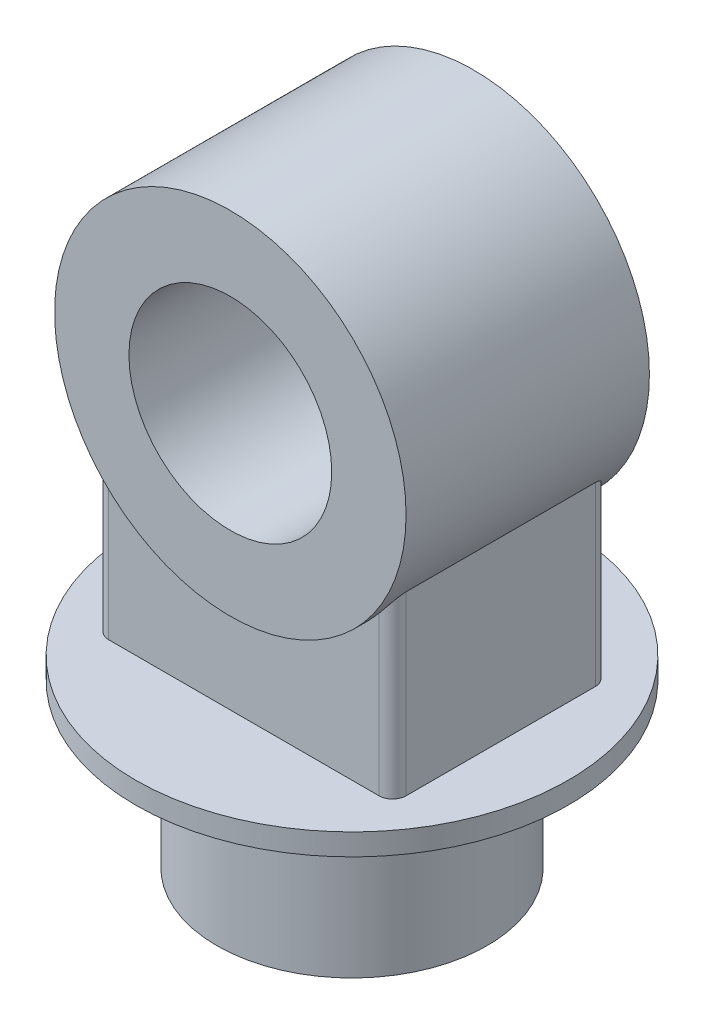
ISO-10303-21;
HEADER;
FILE_DESCRIPTION(('STEP AP214'),'2;1');
FILE_NAME('part.step','',(''),(''),'','','');
FILE_SCHEMA(('AUTOMOTIVE_DESIGN { 1 0 10303 214 1 1 1 1 }'));
ENDSEC;
DATA;
#1=APPLICATION_CONTEXT('core data for automotive mechanical design processes');
#2=APPLICATION_PROTOCOL_DEFINITION('international standard','automotive_design',2000,#1);
#3=PRODUCT_CONTEXT('',#1,'mechanical');
#4=PRODUCT('Part','Part','',(#3));
#5=PRODUCT_RELATED_PRODUCT_CATEGORY('part','',(#4));
#6=PRODUCT_DEFINITION_FORMATION('','',#4);
#7=PRODUCT_DEFINITION_CONTEXT('part definition',#1,'design');
#8=PRODUCT_DEFINITION('design','',#6,#7);
#9=PRODUCT_DEFINITION_SHAPE('','',#8);
#10=(LENGTH_UNIT() NAMED_UNIT(*) SI_UNIT(.MILLI.,.METRE.));
#11=(NAMED_UNIT(*) PLANE_ANGLE_UNIT() SI_UNIT($,.RADIAN.));
#12=(NAMED_UNIT(*) SI_UNIT($,.STERADIAN.) SOLID_ANGLE_UNIT());
#13=UNCERTAINTY_MEASURE_WITH_UNIT(LENGTH_MEASURE(1.E-05),#10,'distance_accuracy_value','');
#14=(GEOMETRIC_REPRESENTATION_CONTEXT(3) GLOBAL_UNCERTAINTY_ASSIGNED_CONTEXT((#13)) GLOBAL_UNIT_ASSIGNED_CONTEXT((#10,
#11,#12)) REPRESENTATION_CONTEXT('',''));
#15=CARTESIAN_POINT('',(0.,0.,0.));
#16=DIRECTION('',(0.,0.,1.));
#17=DIRECTION('',(1.,0.,0.));
#18=AXIS2_PLACEMENT_3D('',#15,#16,#17);
#19=CARTESIAN_POINT('',(0.,120.,0.));
#20=DIRECTION('',(0.,-1.,0.));
#21=DIRECTION('',(0.,0.,-1.));
#22=AXIS2_PLACEMENT_3D('',#19,#20,#21);
#23=CYLINDRICAL_SURFACE('',#22,100.);
#24=CARTESIAN_POINT('',(0.,120.,0.));
#25=DIRECTION('',(0.,1.,0.));
#26=DIRECTION('',(0.,0.,1.));
#27=AXIS2_PLACEMENT_3D('',#24,#25,#26);
#28=CIRCLE('',#27,100.);
#29=CARTESIAN_POINT('',(0.,120.,100.));
#30=VERTEX_POINT('',#29);
#31=EDGE_CURVE('E137',#30,#30,#28,.T.);
#32=ORIENTED_EDGE('',*,*,#31,.F.);
#33=EDGE_LOOP('',(#32));
#34=FACE_BOUND('',#33,.T.);
#35=CARTESIAN_POINT('',(0.,0.,0.));
#36=DIRECTION('',(0.,1.,0.));
#37=DIRECTION('',(0.,0.,1.));
#38=AXIS2_PLACEMENT_3D('',#35,#36,#37);
#39=CIRCLE('',#38,100.);
#40=CARTESIAN_POINT('',(0.,0.,100.));
#41=VERTEX_POINT('',#40);
#42=EDGE_CURVE('E213',#41,#41,#39,.T.);
#43=ORIENTED_EDGE('',*,*,#42,.T.);
#44=EDGE_LOOP('',(#43));
#45=FACE_BOUND('',#44,.T.);
#46=ADVANCED_FACE('F37',(#34,#45),#23,.T.);
#47=CARTESIAN_POINT('',(0.,0.,0.));
#48=DIRECTION('',(0.,1.,0.));
#49=DIRECTION('',(0.,0.,1.));
#50=AXIS2_PLACEMENT_3D('',#47,#48,#49);
#51=PLANE('',#50);
#52=ORIENTED_EDGE('',*,*,#42,.F.);
#53=EDGE_LOOP('',(#52));
#54=FACE_BOUND('',#53,.T.);
#55=ADVANCED_FACE('F201',(#54),#51,.F.);
#56=CARTESIAN_POINT('',(0.,136.,0.));
#57=DIRECTION('',(0.,-1.,0.));
#58=DIRECTION('',(0.,0.,-1.));
#59=AXIS2_PLACEMENT_3D('',#56,#57,#58);
#60=CYLINDRICAL_SURFACE('',#59,160.);
#61=CARTESIAN_POINT('',(0.,136.,0.));
#62=DIRECTION('',(0.,1.,0.));
#63=DIRECTION('',(0.,0.,1.));
#64=AXIS2_PLACEMENT_3D('',#61,#62,#63);
#65=CIRCLE('',#64,160.);
#66=CARTESIAN_POINT('',(0.,136.,160.));
#67=VERTEX_POINT('',#66);
#68=EDGE_CURVE('E214',#67,#67,#65,.T.);
#69=ORIENTED_EDGE('',*,*,#68,.F.);
#70=EDGE_LOOP('',(#69));
#71=FACE_BOUND('',#70,.T.);
#72=CARTESIAN_POINT('',(0.,120.,0.));
#73=DIRECTION('',(0.,1.,0.));
#74=DIRECTION('',(0.,0.,1.));
#75=AXIS2_PLACEMENT_3D('',#72,#73,#74);
#76=CIRCLE('',#75,160.);
#77=CARTESIAN_POINT('',(0.,120.,160.));
#78=VERTEX_POINT('',#77);
#79=EDGE_CURVE('E129',#78,#78,#76,.T.);
#80=ORIENTED_EDGE('',*,*,#79,.T.);
#81=EDGE_LOOP('',(#80));
#82=FACE_BOUND('',#81,.T.);
#83=ADVANCED_FACE('F206',(#71,#82),#60,.T.);
#84=CARTESIAN_POINT('',(0.,136.,0.));
#85=DIRECTION('',(0.,1.,0.));
#86=DIRECTION('',(0.,0.,1.));
#87=AXIS2_PLACEMENT_3D('',#84,#85,#86);
#88=PLANE('',#87);
#89=DIRECTION('',(0.,0.,1.));
#90=VECTOR('',#89,1.);
#91=CARTESIAN_POINT('',(-110.,136.,80.));
#92=LINE('',#91,#90);
#93=CARTESIAN_POINT('',(-110.,136.,-70.));
#94=VERTEX_POINT('',#93);
#95=CARTESIAN_POINT('',(-110.,136.,70.));
#96=VERTEX_POINT('',#95);
#97=EDGE_CURVE('E224',#94,#96,#92,.T.);
#98=ORIENTED_EDGE('',*,*,#97,.F.);
#99=CARTESIAN_POINT('',(-100.,136.,-70.));
#100=DIRECTION('',(0.,1.,0.));
#101=DIRECTION('',(0.,0.,1.));
#102=AXIS2_PLACEMENT_3D('',#99,#100,#101);
#103=CIRCLE('',#102,10.);
#104=CARTESIAN_POINT('',(-100.,136.,-80.));
#105=VERTEX_POINT('',#104);
#106=EDGE_CURVE('E65',#94,#105,#103,.F.);
#107=ORIENTED_EDGE('',*,*,#106,.T.);
#108=DIRECTION('',(-1.,0.,0.));
#109=VECTOR('',#108,1.);
#110=CARTESIAN_POINT('',(110.,136.,-80.));
#111=LINE('',#110,#109);
#112=CARTESIAN_POINT('',(100.,136.,-80.));
#113=VERTEX_POINT('',#112);
#114=EDGE_CURVE('E226',#113,#105,#111,.T.);
#115=ORIENTED_EDGE('',*,*,#114,.F.);
#116=CARTESIAN_POINT('',(100.,136.,-70.));
#117=DIRECTION('',(0.,1.,0.));
#118=DIRECTION('',(0.,0.,1.));
#119=AXIS2_PLACEMENT_3D('',#116,#117,#118);
#120=CIRCLE('',#119,10.);
#121=CARTESIAN_POINT('',(110.,136.,-70.));
#122=VERTEX_POINT('',#121);
#123=EDGE_CURVE('E120',#113,#122,#120,.F.);
#124=ORIENTED_EDGE('',*,*,#123,.T.);
#125=DIRECTION('',(0.,0.,-1.));
#126=VECTOR('',#125,1.);
#127=CARTESIAN_POINT('',(110.,136.,80.));
#128=LINE('',#127,#126);
#129=CARTESIAN_POINT('',(110.,136.,70.));
#130=VERTEX_POINT('',#129);
#131=EDGE_CURVE('E230',#130,#122,#128,.T.);
#132=ORIENTED_EDGE('',*,*,#131,.F.);
#133=CARTESIAN_POINT('',(100.,136.,70.));
#134=DIRECTION('',(0.,1.,0.));
#135=DIRECTION('',(0.,0.,1.));
#136=AXIS2_PLACEMENT_3D('',#133,#134,#135);
#137=CIRCLE('',#136,10.);
#138=CARTESIAN_POINT('',(100.,136.,80.));
#139=VERTEX_POINT('',#138);
#140=EDGE_CURVE('E119',#130,#139,#137,.F.);
#141=ORIENTED_EDGE('',*,*,#140,.T.);
#142=DIRECTION('',(1.,0.,0.));
#143=VECTOR('',#142,1.);
#144=CARTESIAN_POINT('',(110.,136.,80.));
#145=LINE('',#144,#143);
#146=CARTESIAN_POINT('',(-100.,136.,80.));
#147=VERTEX_POINT('',#146);
#148=EDGE_CURVE('E193',#147,#139,#145,.T.);
#149=ORIENTED_EDGE('',*,*,#148,.F.);
#150=CARTESIAN_POINT('',(-100.,136.,70.));
#151=DIRECTION('',(0.,1.,0.));
#152=DIRECTION('',(0.,0.,1.));
#153=AXIS2_PLACEMENT_3D('',#150,#151,#152);
#154=CIRCLE('',#153,10.);
#155=EDGE_CURVE('E51',#147,#96,#154,.F.);
#156=ORIENTED_EDGE('',*,*,#155,.T.);
#157=EDGE_LOOP('',(#98,#107,#115,#124,#132,#141,#149,#156));
#158=FACE_BOUND('',#157,.T.);
#159=ORIENTED_EDGE('',*,*,#68,.T.);
#160=EDGE_LOOP('',(#159));
#161=FACE_BOUND('',#160,.T.);
#162=ADVANCED_FACE('F343',(#158,#161),#88,.T.);
#163=CARTESIAN_POINT('',(0.,120.,0.));
#164=DIRECTION('',(0.,1.,0.));
#165=DIRECTION('',(0.,0.,1.));
#166=AXIS2_PLACEMENT_3D('',#163,#164,#165);
#167=PLANE('',#166);
#168=ORIENTED_EDGE('',*,*,#31,.T.);
#169=EDGE_LOOP('',(#168));
#170=FACE_BOUND('',#169,.T.);
#171=ORIENTED_EDGE('',*,*,#79,.F.);
#172=EDGE_LOOP('',(#171));
#173=FACE_BOUND('',#172,.T.);
#174=ADVANCED_FACE('F320',(#170,#173),#167,.F.);
#175=CARTESIAN_POINT('',(110.,466.002,80.));
#176=DIRECTION('',(0.,0.,-1.));
#177=DIRECTION('',(-1.,0.,0.));
#178=AXIS2_PLACEMENT_3D('',#175,#176,#177);
#179=PLANE('',#178);
#180=ORIENTED_EDGE('',*,*,#148,.T.);
#181=DIRECTION('',(0.,-1.,0.));
#182=VECTOR('',#181,1.);
#183=CARTESIAN_POINT('',(100.,466.002,80.));
#184=LINE('',#183,#182);
#185=CARTESIAN_POINT('',(100.,252.933761370819,80.));
#186=VERTEX_POINT('',#185);
#187=EDGE_CURVE('E145',#139,#186,#184,.F.);
#188=ORIENTED_EDGE('',*,*,#187,.T.);
#189=CARTESIAN_POINT('',(0.,336.,80.));
#190=DIRECTION('',(0.,0.,-1.));
#191=DIRECTION('',(-1.,0.,0.));
#192=AXIS2_PLACEMENT_3D('',#189,#190,#191);
#193=CIRCLE('',#192,130.);
#194=CARTESIAN_POINT('',(-100.,252.933761370819,80.));
#195=VERTEX_POINT('',#194);
#196=EDGE_CURVE('E192',#195,#186,#193,.F.);
#197=ORIENTED_EDGE('',*,*,#196,.F.);
#198=DIRECTION('',(0.,-1.,0.));
#199=VECTOR('',#198,1.);
#200=CARTESIAN_POINT('',(-100.,466.002,80.));
#201=LINE('',#200,#199);
#202=EDGE_CURVE('E142',#195,#147,#201,.T.);
#203=ORIENTED_EDGE('',*,*,#202,.T.);
#204=EDGE_LOOP('',(#180,#188,#197,#203));
#205=FACE_BOUND('',#204,.T.);
#206=ADVANCED_FACE('F313',(#205),#179,.F.);
#207=CARTESIAN_POINT('',(-110.,466.002,80.));
#208=DIRECTION('',(1.,0.,0.));
#209=DIRECTION('',(0.,0.,-1.));
#210=AXIS2_PLACEMENT_3D('',#207,#208,#209);
#211=PLANE('',#210);
#212=DIRECTION('',(0.,0.,-1.));
#213=VECTOR('',#212,1.);
#214=CARTESIAN_POINT('',(-110.,266.717967697245,90.));
#215=LINE('',#214,#213);
#216=CARTESIAN_POINT('',(-110.,266.717967697245,-69.9999999999999));
#217=VERTEX_POINT('',#216);
#218=CARTESIAN_POINT('',(-110.,266.717967697245,70.));
#219=VERTEX_POINT('',#218);
#220=EDGE_CURVE('E187',#217,#219,#215,.F.);
#221=ORIENTED_EDGE('',*,*,#220,.F.);
#222=DIRECTION('',(0.,-1.,0.));
#223=VECTOR('',#222,1.);
#224=CARTESIAN_POINT('',(-110.,466.002,-70.));
#225=LINE('',#224,#223);
#226=EDGE_CURVE('E149',#217,#94,#225,.T.);
#227=ORIENTED_EDGE('',*,*,#226,.T.);
#228=ORIENTED_EDGE('',*,*,#97,.T.);
#229=DIRECTION('',(0.,-1.,0.));
#230=VECTOR('',#229,1.);
#231=CARTESIAN_POINT('',(-110.,466.002,70.));
#232=LINE('',#231,#230);
#233=EDGE_CURVE('E147',#96,#219,#232,.F.);
#234=ORIENTED_EDGE('',*,*,#233,.T.);
#235=EDGE_LOOP('',(#221,#227,#228,#234));
#236=FACE_BOUND('',#235,.T.);
#237=ADVANCED_FACE('F190',(#236),#211,.F.);
#238=CARTESIAN_POINT('',(110.,466.002,80.));
#239=DIRECTION('',(-1.,0.,0.));
#240=DIRECTION('',(0.,0.,1.));
#241=AXIS2_PLACEMENT_3D('',#238,#239,#240);
#242=PLANE('',#241);
#243=ORIENTED_EDGE('',*,*,#131,.T.);
#244=DIRECTION('',(0.,-1.,0.));
#245=VECTOR('',#244,1.);
#246=CARTESIAN_POINT('',(110.,466.002,-70.));
#247=LINE('',#246,#245);
#248=CARTESIAN_POINT('',(110.,266.717967697245,-70.));
#249=VERTEX_POINT('',#248);
#250=EDGE_CURVE('E135',#122,#249,#247,.F.);
#251=ORIENTED_EDGE('',*,*,#250,.T.);
#252=DIRECTION('',(0.,0.,-1.));
#253=VECTOR('',#252,1.);
#254=CARTESIAN_POINT('',(110.,266.717967697245,90.));
#255=LINE('',#254,#253);
#256=CARTESIAN_POINT('',(110.,266.717967697245,70.));
#257=VERTEX_POINT('',#256);
#258=EDGE_CURVE('E115',#257,#249,#255,.T.);
#259=ORIENTED_EDGE('',*,*,#258,.F.);
#260=DIRECTION('',(0.,-1.,0.));
#261=VECTOR('',#260,1.);
#262=CARTESIAN_POINT('',(110.,466.002,70.));
#263=LINE('',#262,#261);
#264=EDGE_CURVE('E132',#257,#130,#263,.T.);
#265=ORIENTED_EDGE('',*,*,#264,.T.);
#266=EDGE_LOOP('',(#243,#251,#259,#265));
#267=FACE_BOUND('',#266,.T.);
#268=ADVANCED_FACE('F297',(#267),#242,.F.);
#269=CARTESIAN_POINT('',(110.,466.002,-80.));
#270=DIRECTION('',(0.,0.,1.));
#271=DIRECTION('',(1.,0.,0.));
#272=AXIS2_PLACEMENT_3D('',#269,#270,#271);
#273=PLANE('',#272);
#274=CARTESIAN_POINT('',(0.,336.,-80.));
#275=DIRECTION('',(0.,0.,1.));
#276=DIRECTION('',(1.,0.,0.));
#277=AXIS2_PLACEMENT_3D('',#274,#275,#276);
#278=CIRCLE('',#277,130.);
#279=CARTESIAN_POINT('',(100.,252.933761370819,-80.));
#280=VERTEX_POINT('',#279);
#281=CARTESIAN_POINT('',(-100.,252.933761370819,-79.9999999999999));
#282=VERTEX_POINT('',#281);
#283=EDGE_CURVE('E112',#280,#282,#278,.F.);
#284=ORIENTED_EDGE('',*,*,#283,.F.);
#285=DIRECTION('',(0.,-1.,0.));
#286=VECTOR('',#285,1.);
#287=CARTESIAN_POINT('',(100.,466.002,-80.));
#288=LINE('',#287,#286);
#289=EDGE_CURVE('E126',#280,#113,#288,.T.);
#290=ORIENTED_EDGE('',*,*,#289,.T.);
#291=ORIENTED_EDGE('',*,*,#114,.T.);
#292=DIRECTION('',(0.,-1.,0.));
#293=VECTOR('',#292,1.);
#294=CARTESIAN_POINT('',(-100.,466.002,-80.));
#295=LINE('',#294,#293);
#296=EDGE_CURVE('E128',#105,#282,#295,.F.);
#297=ORIENTED_EDGE('',*,*,#296,.T.);
#298=EDGE_LOOP('',(#284,#290,#291,#297));
#299=FACE_BOUND('',#298,.T.);
#300=ADVANCED_FACE('F124',(#299),#273,.F.);
#301=CARTESIAN_POINT('',(0.,336.,90.));
#302=DIRECTION('',(0.,0.,-1.));
#303=DIRECTION('',(-1.,0.,0.));
#304=AXIS2_PLACEMENT_3D('',#301,#302,#303);
#305=CYLINDRICAL_SURFACE('',#304,130.);
#306=CARTESIAN_POINT('',(0.,336.,90.));
#307=DIRECTION('',(0.,0.,1.));
#308=DIRECTION('',(1.,0.,0.));
#309=AXIS2_PLACEMENT_3D('',#306,#307,#308);
#310=CIRCLE('',#309,130.);
#311=CARTESIAN_POINT('',(130.,336.,90.));
#312=VERTEX_POINT('',#311);
#313=EDGE_CURVE('E227',#312,#312,#310,.T.);
#314=ORIENTED_EDGE('',*,*,#313,.F.);
#315=EDGE_LOOP('',(#314));
#316=FACE_BOUND('',#315,.T.);
#317=CARTESIAN_POINT('',(0.,336.,-90.));
#318=DIRECTION('',(0.,0.,1.));
#319=DIRECTION('',(1.,0.,0.));
#320=AXIS2_PLACEMENT_3D('',#317,#318,#319);
#321=CIRCLE('',#320,130.);
#322=CARTESIAN_POINT('',(130.,336.,-90.));
#323=VERTEX_POINT('',#322);
#324=EDGE_CURVE('E234',#323,#323,#321,.T.);
#325=ORIENTED_EDGE('',*,*,#324,.T.);
#326=EDGE_LOOP('',(#325));
#327=FACE_BOUND('',#326,.T.);
#328=ORIENTED_EDGE('',*,*,#283,.T.);
#329=CARTESIAN_POINT('',(-100.,252.933761370819,-80.));
#330=CARTESIAN_POINT('',(-100.223611151915,253.202952503255,-79.9999830665315));
#331=CARTESIAN_POINT('',(-100.446118360057,253.473036166024,-79.9924995885084));
#332=CARTESIAN_POINT('',(-100.888548742496,254.014496760122,-79.9629173131462));
#333=CARTESIAN_POINT('',(-101.108472043759,254.285873626978,-79.9408192370115));
#334=CARTESIAN_POINT('',(-101.545586290072,254.829711400373,-79.8822979337703));
#335=CARTESIAN_POINT('',(-101.76277446753,255.102173087004,-79.8458612385231));
#336=CARTESIAN_POINT('',(-102.193849033468,255.647413797012,-79.7588609087487));
#337=CARTESIAN_POINT('',(-102.407735374993,255.920192824843,-79.7082970735217));
#338=CARTESIAN_POINT('',(-103.048408055095,256.74400885936,-79.5343891784366));
#339=CARTESIAN_POINT('',(-103.469748368072,257.294974230618,-79.3894263280957));
#340=CARTESIAN_POINT('',(-104.088382224678,258.11722484377,-79.1288060997197));
#341=CARTESIAN_POINT('',(-104.292337034927,258.39057162742,-79.0347525474724));
#342=CARTESIAN_POINT('',(-104.695498702643,258.935304765081,-78.8319429710981));
#343=CARTESIAN_POINT('',(-104.894706004332,259.206691300842,-78.7231883289499));
#344=CARTESIAN_POINT('',(-105.336170271764,259.812965668139,-78.4620472638272));
#345=CARTESIAN_POINT('',(-105.577006541077,260.147108038148,-78.3055009036512));
#346=CARTESIAN_POINT('',(-106.04966094987,260.809343252621,-77.9678086263909));
#347=CARTESIAN_POINT('',(-106.281479043935,261.137436066616,-77.7866625854443));
#348=CARTESIAN_POINT('',(-106.734152264033,261.784259610706,-77.3986376161628));
#349=CARTESIAN_POINT('',(-106.955036134368,262.103013877598,-77.1918317878757));
#350=CARTESIAN_POINT('',(-107.384708325122,262.728803605627,-76.749894392022));
#351=CARTESIAN_POINT('',(-107.593501627276,263.035843875289,-76.5147746155492));
#352=CARTESIAN_POINT('',(-107.921279015409,263.522080966666,-76.1068757916445));
#353=CARTESIAN_POINT('',(-108.044709884718,263.706240813682,-75.9435605188262));
#354=CARTESIAN_POINT('',(-108.284949666933,264.066582834907,-75.6038296157537));
#355=CARTESIAN_POINT('',(-108.401760304956,264.242767084986,-75.4274174262628));
#356=CARTESIAN_POINT('',(-108.627683741988,264.585236991633,-75.0605773993745));
#357=CARTESIAN_POINT('',(-108.736797961361,264.751524473746,-74.8701521613912));
#358=CARTESIAN_POINT('',(-108.945874410432,265.071634412635,-74.4745306992527));
#359=CARTESIAN_POINT('',(-109.04583974995,265.225461102935,-74.2693395369044));
#360=CARTESIAN_POINT('',(-109.274660386151,265.579056080623,-73.7536743100226));
#361=CARTESIAN_POINT('',(-109.398046362816,265.771031349643,-73.4351396850741));
#362=CARTESIAN_POINT('',(-109.561336457207,266.026263049992,-72.9345418523035));
#363=CARTESIAN_POINT('',(-109.612072269395,266.105785634321,-72.7641622498836));
#364=CARTESIAN_POINT('',(-109.705421847597,266.25239837099,-72.4160328323222));
#365=CARTESIAN_POINT('',(-109.748040656091,266.319496241142,-72.2382876769632));
#366=CARTESIAN_POINT('',(-109.820262744001,266.433384610412,-71.8947331689276));
#367=CARTESIAN_POINT('',(-109.850752312767,266.481551609067,-71.7295676109389));
#368=CARTESIAN_POINT('',(-109.903691363628,266.565274678987,-71.3948451418075));
#369=CARTESIAN_POINT('',(-109.926143541964,266.600834979285,-71.2252897238032));
#370=CARTESIAN_POINT('',(-109.962659042777,266.658707696818,-70.8807814271977));
#371=CARTESIAN_POINT('',(-109.976613864032,266.680848750137,-70.7057875562756));
#372=CARTESIAN_POINT('',(-109.99061964662,266.703076138542,-70.4419386674802));
#373=CARTESIAN_POINT('',(-109.99413386492,266.708654625171,-70.3536902139711));
#374=CARTESIAN_POINT('',(-109.998824989492,266.716102079045,-70.1769662160102));
#375=CARTESIAN_POINT('',(-110.000001659485,266.717970671296,-70.088490649507));
#376=CARTESIAN_POINT('',(-110.,266.717967697245,-70.));
#377=B_SPLINE_CURVE_WITH_KNOTS('',3,(#329,#330,#331,#332,#333,#334,#335,#336,#337,#338,#339,
#340,#341,#342,#343,#344,#345,#346,#347,#348,#349,#350,#351,#352,#353,#354,#355,#356,#357,#358,
#359,#360,#361,#362,#363,#364,#365,#366,#367,#368,#369,#370,#371,#372,#373,#374,#375,#376),
.UNSPECIFIED.,.F.,.F.,(4,2,2,2,2,2,2,2,2,2,2,2,2,2,2,2,2,2,2,2,2,2,2,4),(0.,1.04974156507777,
2.09943133114573,3.15010942417273,4.20080244462032,6.32356278933855,7.38465211465328,
8.44564176134501,9.766776855394,11.0879186017609,12.4053795382949,13.7222937149077,
14.5479419827464,15.3733741023698,16.1986534888326,17.023651302289,18.194686650492,
18.7783719827905,19.3616935243416,19.8852298594993,20.4085904030381,20.9385006934629,
21.2038887699912,21.4693036704869),.UNSPECIFIED.);
#378=EDGE_CURVE('E180',#282,#217,#377,.T.);
#379=ORIENTED_EDGE('',*,*,#378,.T.);
#380=ORIENTED_EDGE('',*,*,#220,.T.);
#381=CARTESIAN_POINT('',(-110.,266.717967697245,70.));
#382=CARTESIAN_POINT('',(-110.000033683462,266.718025852698,70.1614230595313));
#383=CARTESIAN_POINT('',(-109.996092792414,266.711764254296,70.3228118197691));
#384=CARTESIAN_POINT('',(-109.980519982779,266.687045880384,70.6441123999958));
#385=CARTESIAN_POINT('',(-109.968896213713,266.668602027069,70.8040256031146));
#386=CARTESIAN_POINT('',(-109.938376398954,266.620217986395,71.1196424551221));
#387=CARTESIAN_POINT('',(-109.919558261622,266.590400967593,71.2753727040436));
#388=CARTESIAN_POINT('',(-109.875071558334,266.52000006118,71.5834085562727));
#389=CARTESIAN_POINT('',(-109.849400846184,266.479412800404,71.735713070425));
#390=CARTESIAN_POINT('',(-109.784772267017,266.377386983169,72.0722520040975));
#391=CARTESIAN_POINT('',(-109.744103525393,266.313281105855,72.2553511890568));
#392=CARTESIAN_POINT('',(-109.654040532803,266.171650231929,72.6141464391851));
#393=CARTESIAN_POINT('',(-109.604640075501,266.094115691273,72.7898371277865));
#394=CARTESIAN_POINT('',(-109.497968805892,265.927147418338,73.1338723913451));
#395=CARTESIAN_POINT('',(-109.440667457039,265.837667562915,73.302184951541));
#396=CARTESIAN_POINT('',(-109.319341126161,265.648779195145,73.6304969218558));
#397=CARTESIAN_POINT('',(-109.25531768694,265.549372961282,73.7904982269664));
#398=CARTESIAN_POINT('',(-109.085069343255,265.28590129292,74.1868876463209));
#399=CARTESIAN_POINT('',(-108.974781990569,265.115997241409,74.4176642111939));
#400=CARTESIAN_POINT('',(-108.742772943656,264.76058359918,74.8607110351427));
#401=CARTESIAN_POINT('',(-108.621044869784,264.575065307649,75.072970840064));
#402=CARTESIAN_POINT('',(-108.36794946479,264.19164129378,75.4804206329535));
#403=CARTESIAN_POINT('',(-108.236568322626,263.993717884812,75.6755852518652));
#404=CARTESIAN_POINT('',(-107.965814499919,263.588382733387,76.0497203250662));
#405=CARTESIAN_POINT('',(-107.826442440892,263.380971729107,76.2286920360201));
#406=CARTESIAN_POINT('',(-107.56145650763,262.989174407744,76.5468161797373));
#407=CARTESIAN_POINT('',(-107.436764821801,262.805791987749,76.6879854690674));
#408=CARTESIAN_POINT('',(-107.182869679799,262.434497987953,76.9599552926784));
#409=CARTESIAN_POINT('',(-107.053665586411,262.24658576965,77.0907543539386));
#410=CARTESIAN_POINT('',(-106.659844344167,261.677121003612,77.4685356621902));
#411=CARTESIAN_POINT('',(-106.389102445143,261.289965080353,77.7008024816961));
#412=CARTESIAN_POINT('',(-105.833418194947,260.504836154638,78.129863631631));
#413=CARTESIAN_POINT('',(-105.548442441802,260.106838810795,78.3265689888296));
#414=CARTESIAN_POINT('',(-104.96676628824,259.304344779382,78.6860846955172));
#415=CARTESIAN_POINT('',(-104.670068038633,258.899849292081,78.8489012287858));
#416=CARTESIAN_POINT('',(-104.024574509401,258.030646711215,79.1623550419402));
#417=CARTESIAN_POINT('',(-103.674248758637,257.565348460988,79.3081944572229));
#418=CARTESIAN_POINT('',(-102.961876677953,256.632523338709,79.558756520093));
#419=CARTESIAN_POINT('',(-102.599828734006,256.16499616738,79.6634734792563));
#420=CARTESIAN_POINT('',(-102.051092736822,255.466397204689,79.7891645729388));
#421=CARTESIAN_POINT('',(-101.868137468165,255.235094848973,79.8257282191265));
#422=CARTESIAN_POINT('',(-101.499966150616,254.77288550036,79.8886289353229));
#423=CARTESIAN_POINT('',(-101.314750133026,254.541978502041,79.9149661467555));
#424=CARTESIAN_POINT('',(-100.942320486513,254.080919722901,79.9572665465168));
#425=CARTESIAN_POINT('',(-100.755107350153,253.850767773367,79.9732322353467));
#426=CARTESIAN_POINT('',(-100.378860262163,253.391449185777,79.9945948234744));
#427=CARTESIAN_POINT('',(-100.189826234412,253.162282589497,79.9999912789888));
#428=CARTESIAN_POINT('',(-100.,252.933761370819,80.));
#429=B_SPLINE_CURVE_WITH_KNOTS('',3,(#381,#382,#383,#384,#385,#386,#387,#388,#389,#390,#391,
#392,#393,#394,#395,#396,#397,#398,#399,#400,#401,#402,#403,#404,#405,#406,#407,#408,#409,#410,
#411,#412,#413,#414,#415,#416,#417,#418,#419,#420,#421,#422,#423,#424,#425,#426,#427,#428),
.UNSPECIFIED.,.F.,.F.,(4,2,2,2,2,2,2,2,2,2,2,2,2,2,2,2,2,2,2,2,2,2,2,4),(0.,0.484045005923071,
0.967577389145409,1.44601544684507,1.92460352520313,2.51835043890466,3.11252108624072,
3.70905613988739,4.30545457926273,5.22516595363371,6.14539326092325,7.06696382284193,
7.98846280401965,8.77680092000543,9.56525081419903,11.1426900482287,12.7240229357798,
14.305067020047,16.1047501551829,17.9046821508917,18.7960435003637,19.6873925225408,
20.5785265668947,21.4696980275818),.UNSPECIFIED.);
#430=EDGE_CURVE('E11',#219,#195,#429,.T.);
#431=ORIENTED_EDGE('',*,*,#430,.T.);
#432=ORIENTED_EDGE('',*,*,#196,.T.);
#433=CARTESIAN_POINT('',(100.,252.933761370819,80.));
#434=CARTESIAN_POINT('',(100.223611151915,253.202952503255,79.9999830665315));
#435=CARTESIAN_POINT('',(100.446118360057,253.473036166024,79.9924995885085));
#436=CARTESIAN_POINT('',(100.888548742496,254.014496760122,79.9629173131463));
#437=CARTESIAN_POINT('',(101.108472043759,254.285873626978,79.9408192370116));
#438=CARTESIAN_POINT('',(101.545586290072,254.829711400373,79.8822979337703));
#439=CARTESIAN_POINT('',(101.76277446753,255.102173087004,79.8458612385231));
#440=CARTESIAN_POINT('',(102.193849033468,255.647413797012,79.7588609087488));
#441=CARTESIAN_POINT('',(102.407735374993,255.920192824843,79.7082970735217));
#442=CARTESIAN_POINT('',(103.048408055095,256.74400885936,79.5343891784366));
#443=CARTESIAN_POINT('',(103.469748368072,257.294974230618,79.3894263280958));
#444=CARTESIAN_POINT('',(104.088382224678,258.117224843771,79.1288060997197));
#445=CARTESIAN_POINT('',(104.292337034927,258.39057162742,79.0347525474724));
#446=CARTESIAN_POINT('',(104.695498702643,258.935304765081,78.8319429710982));
#447=CARTESIAN_POINT('',(104.894706004332,259.206691300842,78.7231883289499));
#448=CARTESIAN_POINT('',(105.336170271764,259.812965668139,78.4620472638272));
#449=CARTESIAN_POINT('',(105.577006541077,260.147108038148,78.3055009036513));
#450=CARTESIAN_POINT('',(106.049660949871,260.809343252621,77.967808626391));
#451=CARTESIAN_POINT('',(106.281479043935,261.137436066616,77.7866625854444));
#452=CARTESIAN_POINT('',(106.734152264033,261.784259610706,77.3986376161628));
#453=CARTESIAN_POINT('',(106.955036134368,262.103013877598,77.1918317878757));
#454=CARTESIAN_POINT('',(107.384708325122,262.728803605627,76.749894392022));
#455=CARTESIAN_POINT('',(107.593501627276,263.035843875289,76.5147746155492));
#456=CARTESIAN_POINT('',(107.921279015409,263.522080966667,76.1068757916445));
#457=CARTESIAN_POINT('',(108.044709884718,263.706240813682,75.9435605188262));
#458=CARTESIAN_POINT('',(108.284949666933,264.066582834907,75.6038296157537));
#459=CARTESIAN_POINT('',(108.401760304956,264.242767084986,75.4274174262628));
#460=CARTESIAN_POINT('',(108.627683741988,264.585236991633,75.0605773993746));
#461=CARTESIAN_POINT('',(108.736797961361,264.751524473746,74.8701521613912));
#462=CARTESIAN_POINT('',(108.945874410432,265.071634412635,74.4745306992527));
#463=CARTESIAN_POINT('',(109.04583974995,265.225461102935,74.2693395369045));
#464=CARTESIAN_POINT('',(109.274660386151,265.579056080623,73.7536743100227));
#465=CARTESIAN_POINT('',(109.398046362816,265.771031349643,73.4351396850742));
#466=CARTESIAN_POINT('',(109.561336457207,266.026263049992,72.9345418523035));
#467=CARTESIAN_POINT('',(109.612072269395,266.105785634321,72.7641622498836));
#468=CARTESIAN_POINT('',(109.705421847597,266.25239837099,72.4160328323222));
#469=CARTESIAN_POINT('',(109.748040656091,266.319496241142,72.2382876769632));
#470=CARTESIAN_POINT('',(109.820262744001,266.433384610412,71.8947331689276));
#471=CARTESIAN_POINT('',(109.850752312767,266.481551609067,71.729567610939));
#472=CARTESIAN_POINT('',(109.903691363628,266.565274678987,71.3948451418076));
#473=CARTESIAN_POINT('',(109.926143541964,266.600834979285,71.2252897238033));
#474=CARTESIAN_POINT('',(109.962659042777,266.658707696818,70.8807814271977));
#475=CARTESIAN_POINT('',(109.976613864032,266.680848750137,70.7057875562757));
#476=CARTESIAN_POINT('',(109.99061964662,266.703076138542,70.4419386674803));
#477=CARTESIAN_POINT('',(109.99413386492,266.708654625171,70.3536902139711));
#478=CARTESIAN_POINT('',(109.998824989492,266.716102079046,70.1769662160102));
#479=CARTESIAN_POINT('',(110.000001659485,266.717970671296,70.088490649507));
#480=CARTESIAN_POINT('',(110.,266.717967697245,70.));
#481=B_SPLINE_CURVE_WITH_KNOTS('',3,(#433,#434,#435,#436,#437,#438,#439,#440,#441,#442,#443,
#444,#445,#446,#447,#448,#449,#450,#451,#452,#453,#454,#455,#456,#457,#458,#459,#460,#461,#462,
#463,#464,#465,#466,#467,#468,#469,#470,#471,#472,#473,#474,#475,#476,#477,#478,#479,#480),
.UNSPECIFIED.,.F.,.F.,(4,2,2,2,2,2,2,2,2,2,2,2,2,2,2,2,2,2,2,2,2,2,2,4),(0.,1.04974156507776,
2.09943133114566,3.15010942417265,4.20080244462031,6.3235627893386,7.38465211465329,
8.44564176134499,9.76677685539393,11.0879186017609,12.4053795382948,13.7222937149078,
14.5479419827465,15.3733741023699,16.1986534888327,17.023651302289,18.194686650492,
18.7783719827906,19.3616935243416,19.8852298594993,20.4085904030381,20.9385006934629,
21.2038887699912,21.4693036704869),.UNSPECIFIED.);
#482=EDGE_CURVE('E173',#186,#257,#481,.T.);
#483=ORIENTED_EDGE('',*,*,#482,.T.);
#484=ORIENTED_EDGE('',*,*,#258,.T.);
#485=CARTESIAN_POINT('',(110.,266.717967697245,-70.));
#486=CARTESIAN_POINT('',(110.000033683462,266.718025852698,-70.1614230595313));
#487=CARTESIAN_POINT('',(109.996092792414,266.711764254296,-70.3228118197691));
#488=CARTESIAN_POINT('',(109.980519982779,266.687045880384,-70.6441123999957));
#489=CARTESIAN_POINT('',(109.968896213713,266.668602027069,-70.8040256031146));
#490=CARTESIAN_POINT('',(109.938376398954,266.620217986395,-71.1196424551221));
#491=CARTESIAN_POINT('',(109.919558261622,266.590400967593,-71.2753727040436));
#492=CARTESIAN_POINT('',(109.875071558334,266.52000006118,-71.5834085562726));
#493=CARTESIAN_POINT('',(109.849400846184,266.479412800404,-71.7357130704249));
#494=CARTESIAN_POINT('',(109.784772267017,266.377386983169,-72.0722520040974));
#495=CARTESIAN_POINT('',(109.744103525393,266.313281105856,-72.2553511890568));
#496=CARTESIAN_POINT('',(109.654040532803,266.17165023193,-72.6141464391851));
#497=CARTESIAN_POINT('',(109.604640075501,266.094115691273,-72.7898371277865));
#498=CARTESIAN_POINT('',(109.497968805892,265.927147418338,-73.1338723913451));
#499=CARTESIAN_POINT('',(109.440667457039,265.837667562915,-73.3021849515411));
#500=CARTESIAN_POINT('',(109.319341126161,265.648779195145,-73.6304969218558));
#501=CARTESIAN_POINT('',(109.25531768694,265.549372961282,-73.7904982269664));
#502=CARTESIAN_POINT('',(109.085069343255,265.28590129292,-74.1868876463209));
#503=CARTESIAN_POINT('',(108.974781990569,265.115997241409,-74.4176642111939));
#504=CARTESIAN_POINT('',(108.742772943656,264.76058359918,-74.8607110351426));
#505=CARTESIAN_POINT('',(108.621044869784,264.575065307649,-75.072970840064));
#506=CARTESIAN_POINT('',(108.36794946479,264.19164129378,-75.4804206329535));
#507=CARTESIAN_POINT('',(108.236568322626,263.993717884812,-75.6755852518652));
#508=CARTESIAN_POINT('',(107.965814499919,263.588382733387,-76.0497203250662));
#509=CARTESIAN_POINT('',(107.826442440892,263.380971729107,-76.2286920360201));
#510=CARTESIAN_POINT('',(107.56145650763,262.989174407744,-76.5468161797372));
#511=CARTESIAN_POINT('',(107.436764821801,262.805791987749,-76.6879854690674));
#512=CARTESIAN_POINT('',(107.182869679799,262.434497987953,-76.9599552926783));
#513=CARTESIAN_POINT('',(107.053665586411,262.24658576965,-77.0907543539386));
#514=CARTESIAN_POINT('',(106.659844344167,261.677121003612,-77.4685356621902));
#515=CARTESIAN_POINT('',(106.389102445143,261.289965080353,-77.7008024816961));
#516=CARTESIAN_POINT('',(105.833418194947,260.504836154638,-78.129863631631));
#517=CARTESIAN_POINT('',(105.548442441802,260.106838810795,-78.3265689888296));
#518=CARTESIAN_POINT('',(104.96676628824,259.304344779382,-78.6860846955171));
#519=CARTESIAN_POINT('',(104.670068038633,258.899849292081,-78.8489012287858));
#520=CARTESIAN_POINT('',(104.024574509401,258.030646711215,-79.1623550419402));
#521=CARTESIAN_POINT('',(103.674248758637,257.565348460988,-79.3081944572228));
#522=CARTESIAN_POINT('',(102.961876677953,256.632523338709,-79.558756520093));
#523=CARTESIAN_POINT('',(102.599828734006,256.16499616738,-79.6634734792563));
#524=CARTESIAN_POINT('',(102.051092736822,255.466397204689,-79.7891645729387));
#525=CARTESIAN_POINT('',(101.868137468165,255.235094848973,-79.8257282191264));
#526=CARTESIAN_POINT('',(101.499966150616,254.77288550036,-79.8886289353229));
#527=CARTESIAN_POINT('',(101.314750133026,254.541978502041,-79.9149661467555));
#528=CARTESIAN_POINT('',(100.942320486513,254.080919722901,-79.9572665465168));
#529=CARTESIAN_POINT('',(100.755107350153,253.850767773367,-79.9732322353467));
#530=CARTESIAN_POINT('',(100.378860262163,253.391449185777,-79.9945948234744));
#531=CARTESIAN_POINT('',(100.189826234412,253.162282589497,-79.9999912789888));
#532=CARTESIAN_POINT('',(100.,252.933761370819,-80.));
#533=B_SPLINE_CURVE_WITH_KNOTS('',3,(#485,#486,#487,#488,#489,#490,#491,#492,#493,#494,#495,
#496,#497,#498,#499,#500,#501,#502,#503,#504,#505,#506,#507,#508,#509,#510,#511,#512,#513,#514,
#515,#516,#517,#518,#519,#520,#521,#522,#523,#524,#525,#526,#527,#528,#529,#530,#531,#532),
.UNSPECIFIED.,.F.,.F.,(4,2,2,2,2,2,2,2,2,2,2,2,2,2,2,2,2,2,2,2,2,2,2,4),(0.,0.48404500592307,
0.967577389145413,1.44601544684507,1.92460352520314,2.51835043890469,3.11252108624077,
3.70905613988743,4.30545457926273,5.22516595363372,6.14539326092329,7.06696382284195,
7.98846280401966,8.77680092000537,9.56525081419896,11.1426900482287,12.7240229357798,
14.305067020047,16.1047501551828,17.9046821508917,18.7960435003637,19.6873925225409,
20.5785265668947,21.4696980275819),.UNSPECIFIED.);
#534=EDGE_CURVE('E109',#249,#280,#533,.T.);
#535=ORIENTED_EDGE('',*,*,#534,.T.);
#536=EDGE_LOOP('',(#328,#379,#380,#431,#432,#483,#484,#535));
#537=FACE_BOUND('',#536,.T.);
#538=ADVANCED_FACE('F111',(#316,#327,#537),#305,.T.);
#539=CARTESIAN_POINT('',(0.,336.,90.));
#540=DIRECTION('',(0.,0.,1.));
#541=DIRECTION('',(1.,0.,0.));
#542=AXIS2_PLACEMENT_3D('',#539,#540,#541);
#543=PLANE('',#542);
#544=ORIENTED_EDGE('',*,*,#313,.T.);
#545=EDGE_LOOP('',(#544));
#546=FACE_BOUND('',#545,.T.);
#547=CARTESIAN_POINT('',(0.,336.,90.));
#548=DIRECTION('',(0.,0.,1.));
#549=DIRECTION('',(1.,0.,0.));
#550=AXIS2_PLACEMENT_3D('',#547,#548,#549);
#551=CIRCLE('',#550,75.);
#552=CARTESIAN_POINT('',(-75.,336.,90.));
#553=VERTEX_POINT('',#552);
#554=EDGE_CURVE('E237',#553,#553,#551,.T.);
#555=ORIENTED_EDGE('',*,*,#554,.F.);
#556=EDGE_LOOP('',(#555));
#557=FACE_BOUND('',#556,.T.);
#558=ADVANCED_FACE('F248',(#546,#557),#543,.T.);
#559=CARTESIAN_POINT('',(0.,336.,-90.));
#560=DIRECTION('',(0.,0.,1.));
#561=DIRECTION('',(1.,0.,0.));
#562=AXIS2_PLACEMENT_3D('',#559,#560,#561);
#563=PLANE('',#562);
#564=ORIENTED_EDGE('',*,*,#324,.F.);
#565=EDGE_LOOP('',(#564));
#566=FACE_BOUND('',#565,.T.);
#567=CARTESIAN_POINT('',(0.,336.,-90.));
#568=DIRECTION('',(0.,0.,1.));
#569=DIRECTION('',(1.,0.,0.));
#570=AXIS2_PLACEMENT_3D('',#567,#568,#569);
#571=CIRCLE('',#570,75.);
#572=CARTESIAN_POINT('',(-75.,336.,-90.));
#573=VERTEX_POINT('',#572);
#574=EDGE_CURVE('E240',#573,#573,#571,.T.);
#575=ORIENTED_EDGE('',*,*,#574,.T.);
#576=EDGE_LOOP('',(#575));
#577=FACE_BOUND('',#576,.T.);
#578=ADVANCED_FACE('F250',(#566,#577),#563,.F.);
#579=CARTESIAN_POINT('',(0.,336.,90.));
#580=DIRECTION('',(0.,0.,-1.));
#581=DIRECTION('',(-1.,0.,0.));
#582=AXIS2_PLACEMENT_3D('',#579,#580,#581);
#583=CYLINDRICAL_SURFACE('',#582,75.);
#584=CARTESIAN_POINT('',(-75.,336.,90.));
#585=CARTESIAN_POINT('',(-75.,336.,88.125));
#586=CARTESIAN_POINT('',(-75.,336.,86.25));
#587=CARTESIAN_POINT('',(-75.,336.,82.5));
#588=CARTESIAN_POINT('',(-75.,336.,80.625));
#589=CARTESIAN_POINT('',(-75.,336.,76.875));
#590=CARTESIAN_POINT('',(-75.,336.,75.));
#591=CARTESIAN_POINT('',(-75.,336.,71.25));
#592=CARTESIAN_POINT('',(-75.,336.,69.375));
#593=CARTESIAN_POINT('',(-75.,336.,65.625));
#594=CARTESIAN_POINT('',(-75.,336.,63.75));
#595=CARTESIAN_POINT('',(-75.,336.,60.));
#596=CARTESIAN_POINT('',(-75.,336.,58.125));
#597=CARTESIAN_POINT('',(-75.,336.,54.375));
#598=CARTESIAN_POINT('',(-75.,336.,52.5));
#599=CARTESIAN_POINT('',(-75.,336.,48.75));
#600=CARTESIAN_POINT('',(-75.,336.,46.875));
#601=CARTESIAN_POINT('',(-75.,336.,43.125));
#602=CARTESIAN_POINT('',(-75.,336.,41.25));
#603=CARTESIAN_POINT('',(-75.,336.,37.5));
#604=CARTESIAN_POINT('',(-75.,336.,35.625));
#605=CARTESIAN_POINT('',(-75.,336.,31.875));
#606=CARTESIAN_POINT('',(-75.,336.,30.));
#607=CARTESIAN_POINT('',(-75.,336.,26.25));
#608=CARTESIAN_POINT('',(-75.,336.,24.375));
#609=CARTESIAN_POINT('',(-75.,336.,20.625));
#610=CARTESIAN_POINT('',(-75.,336.,18.75));
#611=CARTESIAN_POINT('',(-75.,336.,15.));
#612=CARTESIAN_POINT('',(-75.,336.,13.125));
#613=CARTESIAN_POINT('',(-75.,336.,9.37499999999998));
#614=CARTESIAN_POINT('',(-75.,336.,7.49999999999998));
#615=CARTESIAN_POINT('',(-75.,336.,3.74999999999998));
#616=CARTESIAN_POINT('',(-75.,336.,1.87499999999997));
#617=CARTESIAN_POINT('',(-75.,336.,-1.87500000000003));
#618=CARTESIAN_POINT('',(-75.,336.,-3.75000000000003));
#619=CARTESIAN_POINT('',(-75.,336.,-7.50000000000003));
#620=CARTESIAN_POINT('',(-75.,336.,-9.37500000000004));
#621=CARTESIAN_POINT('',(-75.,336.,-13.125));
#622=CARTESIAN_POINT('',(-75.,336.,-15.));
#623=CARTESIAN_POINT('',(-75.,336.,-18.75));
#624=CARTESIAN_POINT('',(-75.,336.,-20.625));
#625=CARTESIAN_POINT('',(-75.,336.,-24.375));
#626=CARTESIAN_POINT('',(-75.,336.,-26.25));
#627=CARTESIAN_POINT('',(-75.,336.,-30.));
#628=CARTESIAN_POINT('',(-75.,336.,-31.875));
#629=CARTESIAN_POINT('',(-75.,336.,-35.625));
#630=CARTESIAN_POINT('',(-75.,336.,-37.5));
#631=CARTESIAN_POINT('',(-75.,336.,-41.25));
#632=CARTESIAN_POINT('',(-75.,336.,-43.125));
#633=CARTESIAN_POINT('',(-75.,336.,-46.875));
#634=CARTESIAN_POINT('',(-75.,336.,-48.75));
#635=CARTESIAN_POINT('',(-75.,336.,-52.5));
#636=CARTESIAN_POINT('',(-75.,336.,-54.375));
#637=CARTESIAN_POINT('',(-75.,336.,-58.125));
#638=CARTESIAN_POINT('',(-75.,336.,-60.));
#639=CARTESIAN_POINT('',(-75.,336.,-63.75));
#640=CARTESIAN_POINT('',(-75.,336.,-65.625));
#641=CARTESIAN_POINT('',(-75.,336.,-69.375));
#642=CARTESIAN_POINT('',(-75.,336.,-71.25));
#643=CARTESIAN_POINT('',(-75.,336.,-75.));
#644=CARTESIAN_POINT('',(-75.,336.,-76.875));
#645=CARTESIAN_POINT('',(-75.,336.,-80.625));
#646=CARTESIAN_POINT('',(-75.,336.,-82.5));
#647=CARTESIAN_POINT('',(-75.,336.,-86.25));
#648=CARTESIAN_POINT('',(-75.,336.,-88.125));
#649=CARTESIAN_POINT('',(-75.,336.,-90.));
#650=B_SPLINE_CURVE_WITH_KNOTS('',3,(#584,#585,#586,#587,#588,#589,#590,#591,#592,#593,#594,
#595,#596,#597,#598,#599,#600,#601,#602,#603,#604,#605,#606,#607,#608,#609,#610,#611,#612,#613,
#614,#615,#616,#617,#618,#619,#620,#621,#622,#623,#624,#625,#626,#627,#628,#629,#630,#631,#632,
#633,#634,#635,#636,#637,#638,#639,#640,#641,#642,#643,#644,#645,#646,#647,#648,#649),
.UNSPECIFIED.,.F.,.F.,(4,2,2,2,2,2,2,2,2,2,2,2,2,2,2,2,2,2,2,2,2,2,2,2,2,2,2,2,2,2,2,2,4),(0.,
5.62499999999999,11.25,16.875,22.5,28.125,33.75,39.375,45.,50.625,56.25,61.875,67.5,73.125,
78.75,84.375,90.,95.625,101.25,106.875,112.5,118.125,123.75,129.375,135.,140.625,146.25,151.875,
157.5,163.125,168.75,174.375,180.),.UNSPECIFIED.);
#651=EDGE_CURVE('BSEAM166',#553,#573,#650,.T.);
#652=ORIENTED_EDGE('',*,*,#554,.T.);
#653=ORIENTED_EDGE('',*,*,#574,.F.);
#654=ORIENTED_EDGE('',*,*,#651,.T.);
#655=ORIENTED_EDGE('',*,*,#651,.F.);
#656=EDGE_LOOP('',(#652,#654,#653,#655));
#657=FACE_BOUND('',#656,.T.);
#658=ADVANCED_FACE('F166',(#657),#583,.F.);
#659=CARTESIAN_POINT('',(100.,466.002,-70.));
#660=DIRECTION('',(0.,-1.,0.));
#661=DIRECTION('',(0.,0.,-1.));
#662=AXIS2_PLACEMENT_3D('',#659,#660,#661);
#663=CYLINDRICAL_SURFACE('',#662,10.);
#664=ORIENTED_EDGE('',*,*,#534,.F.);
#665=ORIENTED_EDGE('',*,*,#250,.F.);
#666=ORIENTED_EDGE('',*,*,#123,.F.);
#667=ORIENTED_EDGE('',*,*,#289,.F.);
#668=EDGE_LOOP('',(#664,#665,#666,#667));
#669=FACE_BOUND('',#668,.T.);
#670=ADVANCED_FACE('F131',(#669),#663,.T.);
#671=CARTESIAN_POINT('',(100.,466.002,70.));
#672=DIRECTION('',(0.,-1.,0.));
#673=DIRECTION('',(0.,0.,-1.));
#674=AXIS2_PLACEMENT_3D('',#671,#672,#673);
#675=CYLINDRICAL_SURFACE('',#674,10.);
#676=ORIENTED_EDGE('',*,*,#482,.F.);
#677=ORIENTED_EDGE('',*,*,#187,.F.);
#678=ORIENTED_EDGE('',*,*,#140,.F.);
#679=ORIENTED_EDGE('',*,*,#264,.F.);
#680=EDGE_LOOP('',(#676,#677,#678,#679));
#681=FACE_BOUND('',#680,.T.);
#682=ADVANCED_FACE('F165',(#681),#675,.T.);
#683=CARTESIAN_POINT('',(-100.,466.002,-70.));
#684=DIRECTION('',(0.,-1.,0.));
#685=DIRECTION('',(0.,0.,-1.));
#686=AXIS2_PLACEMENT_3D('',#683,#684,#685);
#687=CYLINDRICAL_SURFACE('',#686,10.);
#688=ORIENTED_EDGE('',*,*,#378,.F.);
#689=ORIENTED_EDGE('',*,*,#296,.F.);
#690=ORIENTED_EDGE('',*,*,#106,.F.);
#691=ORIENTED_EDGE('',*,*,#226,.F.);
#692=EDGE_LOOP('',(#688,#689,#690,#691));
#693=FACE_BOUND('',#692,.T.);
#694=ADVANCED_FACE('F170',(#693),#687,.T.);
#695=CARTESIAN_POINT('',(-100.,466.002,70.));
#696=DIRECTION('',(0.,-1.,0.));
#697=DIRECTION('',(0.,0.,-1.));
#698=AXIS2_PLACEMENT_3D('',#695,#696,#697);
#699=CYLINDRICAL_SURFACE('',#698,10.);
#700=ORIENTED_EDGE('',*,*,#430,.F.);
#701=ORIENTED_EDGE('',*,*,#233,.F.);
#702=ORIENTED_EDGE('',*,*,#155,.F.);
#703=ORIENTED_EDGE('',*,*,#202,.F.);
#704=EDGE_LOOP('',(#700,#701,#702,#703));
#705=FACE_BOUND('',#704,.T.);
#706=ADVANCED_FACE('F39',(#705),#699,.T.);
#707=CLOSED_SHELL('',(#46,#55,#83,#162,#174,#206,#237,#268,#300,#538,#558,#578,#658,#670,#682,
#694,#706));
#708=MANIFOLD_SOLID_BREP('B2',#707);
#709=ADVANCED_BREP_SHAPE_REPRESENTATION('',(#18,#708),#14);
#710=SHAPE_DEFINITION_REPRESENTATION(#9,#709);
ENDSEC;
END-ISO-10303-21;
